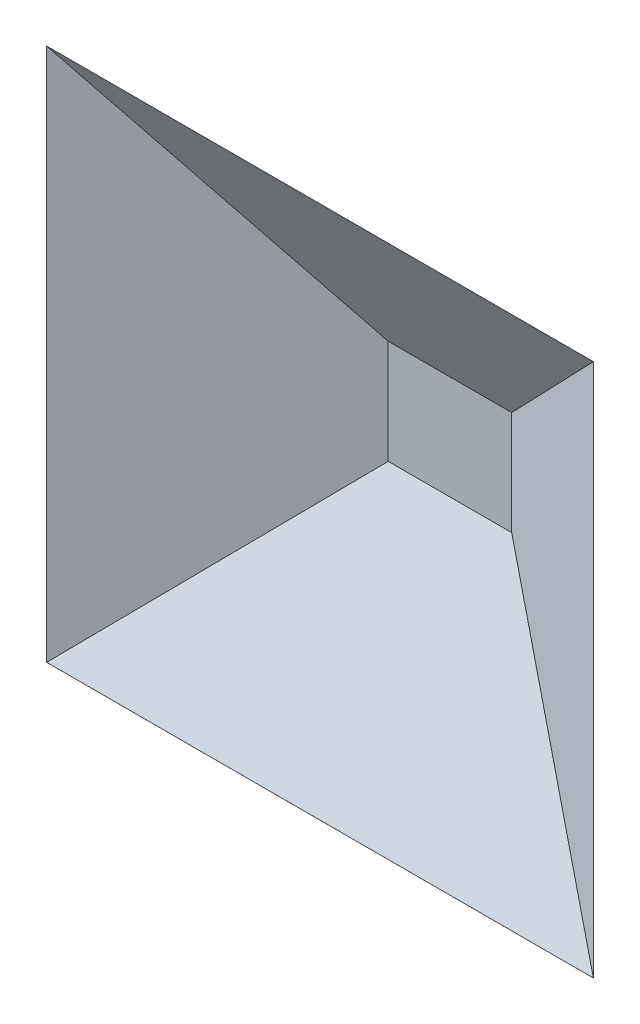
ISO-10303-21;
HEADER;
FILE_DESCRIPTION(('STEP AP214'),'2;1');
FILE_NAME('part.step','',(''),(''),'','','');
FILE_SCHEMA(('AUTOMOTIVE_DESIGN { 1 0 10303 214 1 1 1 1 }'));
ENDSEC;
DATA;
#1=APPLICATION_CONTEXT('core data for automotive mechanical design processes');
#2=APPLICATION_PROTOCOL_DEFINITION('international standard','automotive_design',2000,#1);
#3=PRODUCT_CONTEXT('',#1,'mechanical');
#4=PRODUCT('Part','Part','',(#3));
#5=PRODUCT_RELATED_PRODUCT_CATEGORY('part','',(#4));
#6=PRODUCT_DEFINITION_FORMATION('','',#4);
#7=PRODUCT_DEFINITION_CONTEXT('part definition',#1,'design');
#8=PRODUCT_DEFINITION('design','',#6,#7);
#9=PRODUCT_DEFINITION_SHAPE('','',#8);
#10=(LENGTH_UNIT() NAMED_UNIT(*) SI_UNIT(.MILLI.,.METRE.));
#11=(NAMED_UNIT(*) PLANE_ANGLE_UNIT() SI_UNIT($,.RADIAN.));
#12=(NAMED_UNIT(*) SI_UNIT($,.STERADIAN.) SOLID_ANGLE_UNIT());
#13=UNCERTAINTY_MEASURE_WITH_UNIT(LENGTH_MEASURE(1.E-05),#10,'distance_accuracy_value','');
#14=(GEOMETRIC_REPRESENTATION_CONTEXT(3) GLOBAL_UNCERTAINTY_ASSIGNED_CONTEXT((#13)) GLOBAL_UNIT_ASSIGNED_CONTEXT((#10,
#11,#12)) REPRESENTATION_CONTEXT('',''));
#15=CARTESIAN_POINT('',(0.,0.,0.));
#16=DIRECTION('',(0.,0.,1.));
#17=DIRECTION('',(1.,0.,0.));
#18=AXIS2_PLACEMENT_3D('',#15,#16,#17);
#19=CARTESIAN_POINT('',(0.,0.,100.));
#20=DIRECTION('',(0.,0.,1.));
#21=DIRECTION('',(1.,0.,0.));
#22=AXIS2_PLACEMENT_3D('',#19,#20,#21);
#23=PLANE('',#22);
#24=DIRECTION('',(0.,1.,0.));
#25=VECTOR('',#24,1.);
#26=CARTESIAN_POINT('',(210.280894021878,0.,100.));
#27=LINE('',#26,#25);
#28=CARTESIAN_POINT('',(210.280894021878,-205.280680556426,100.));
#29=VERTEX_POINT('',#28);
#30=CARTESIAN_POINT('',(210.280894021878,205.280680556426,100.));
#31=VERTEX_POINT('',#30);
#32=EDGE_CURVE('E297',#29,#31,#27,.T.);
#33=ORIENTED_EDGE('',*,*,#32,.F.);
#34=DIRECTION('',(1.,0.,0.));
#35=VECTOR('',#34,1.);
#36=CARTESIAN_POINT('',(0.,-205.280680556426,100.));
#37=LINE('',#36,#35);
#38=CARTESIAN_POINT('',(-210.280894021878,-205.280680556426,100.));
#39=VERTEX_POINT('',#38);
#40=EDGE_CURVE('E299',#39,#29,#37,.T.);
#41=ORIENTED_EDGE('',*,*,#40,.F.);
#42=DIRECTION('',(0.,-1.,0.));
#43=VECTOR('',#42,1.);
#44=CARTESIAN_POINT('',(-210.280894021878,0.,100.));
#45=LINE('',#44,#43);
#46=CARTESIAN_POINT('',(-210.280894021878,205.280680556426,100.));
#47=VERTEX_POINT('',#46);
#48=EDGE_CURVE('E309',#47,#39,#45,.T.);
#49=ORIENTED_EDGE('',*,*,#48,.F.);
#50=DIRECTION('',(-1.,0.,0.));
#51=VECTOR('',#50,1.);
#52=CARTESIAN_POINT('',(0.,205.280680556426,100.));
#53=LINE('',#52,#51);
#54=EDGE_CURVE('E302',#31,#47,#53,.T.);
#55=ORIENTED_EDGE('',*,*,#54,.F.);
#56=EDGE_LOOP('',(#33,#41,#49,#55));
#57=FACE_BOUND('',#56,.T.);
#58=DIRECTION('',(0.,1.,0.));
#59=VECTOR('',#58,1.);
#60=CARTESIAN_POINT('',(210.3,205.3,100.));
#61=LINE('',#60,#59);
#62=CARTESIAN_POINT('',(210.3,-205.3,100.));
#63=VERTEX_POINT('',#62);
#64=CARTESIAN_POINT('',(210.3,205.3,100.));
#65=VERTEX_POINT('',#64);
#66=EDGE_CURVE('E115',#63,#65,#61,.T.);
#67=ORIENTED_EDGE('',*,*,#66,.T.);
#68=DIRECTION('',(-1.,0.,0.));
#69=VECTOR('',#68,1.);
#70=CARTESIAN_POINT('',(-210.3,205.3,100.));
#71=LINE('',#70,#69);
#72=CARTESIAN_POINT('',(-210.3,205.3,100.));
#73=VERTEX_POINT('',#72);
#74=EDGE_CURVE('E124',#65,#73,#71,.T.);
#75=ORIENTED_EDGE('',*,*,#74,.T.);
#76=DIRECTION('',(0.,-1.,0.));
#77=VECTOR('',#76,1.);
#78=CARTESIAN_POINT('',(-210.3,205.3,100.));
#79=LINE('',#78,#77);
#80=CARTESIAN_POINT('',(-210.3,-205.3,100.));
#81=VERTEX_POINT('',#80);
#82=EDGE_CURVE('E131',#73,#81,#79,.T.);
#83=ORIENTED_EDGE('',*,*,#82,.T.);
#84=DIRECTION('',(1.,0.,0.));
#85=VECTOR('',#84,1.);
#86=CARTESIAN_POINT('',(-210.3,-205.3,100.));
#87=LINE('',#86,#85);
#88=EDGE_CURVE('E136',#81,#63,#87,.T.);
#89=ORIENTED_EDGE('',*,*,#88,.T.);
#90=EDGE_LOOP('',(#67,#75,#83,#89));
#91=FACE_BOUND('',#90,.T.);
#92=ADVANCED_FACE('F58',(#57,#91),#23,.T.);
#93=CARTESIAN_POINT('',(0.,0.,0.));
#94=DIRECTION('',(0.,0.,1.));
#95=DIRECTION('',(1.,0.,0.));
#96=AXIS2_PLACEMENT_3D('',#93,#94,#95);
#97=PLANE('',#96);
#98=DIRECTION('',(0.,1.,0.));
#99=VECTOR('',#98,1.);
#100=CARTESIAN_POINT('',(47.5,40.,0.));
#101=LINE('',#100,#99);
#102=CARTESIAN_POINT('',(47.5,-40.,0.));
#103=VERTEX_POINT('',#102);
#104=CARTESIAN_POINT('',(47.5,40.,0.));
#105=VERTEX_POINT('',#104);
#106=EDGE_CURVE('E118',#103,#105,#101,.T.);
#107=ORIENTED_EDGE('',*,*,#106,.F.);
#108=DIRECTION('',(1.,0.,0.));
#109=VECTOR('',#108,1.);
#110=CARTESIAN_POINT('',(-47.5,-40.,0.));
#111=LINE('',#110,#109);
#112=CARTESIAN_POINT('',(-47.5,-40.,0.));
#113=VERTEX_POINT('',#112);
#114=EDGE_CURVE('E198',#113,#103,#111,.T.);
#115=ORIENTED_EDGE('',*,*,#114,.F.);
#116=DIRECTION('',(0.,-1.,0.));
#117=VECTOR('',#116,1.);
#118=CARTESIAN_POINT('',(-47.5,40.,0.));
#119=LINE('',#118,#117);
#120=CARTESIAN_POINT('',(-47.5,40.,0.));
#121=VERTEX_POINT('',#120);
#122=EDGE_CURVE('E68',#121,#113,#119,.T.);
#123=ORIENTED_EDGE('',*,*,#122,.F.);
#124=DIRECTION('',(-1.,0.,0.));
#125=VECTOR('',#124,1.);
#126=CARTESIAN_POINT('',(-47.5,40.,0.));
#127=LINE('',#126,#125);
#128=EDGE_CURVE('E13',#105,#121,#127,.T.);
#129=ORIENTED_EDGE('',*,*,#128,.F.);
#130=EDGE_LOOP('',(#107,#115,#123,#129));
#131=FACE_BOUND('',#130,.T.);
#132=ADVANCED_FACE('F166',(#131),#97,.F.);
#133=CARTESIAN_POINT('',(0.,10.7169391135859,-17.7151003547575));
#134=DIRECTION('',(0.,0.517613251221071,-0.85561470426843));
#135=DIRECTION('',(0.,0.85561470426843,0.517613251221071));
#136=AXIS2_PLACEMENT_3D('',#133,#134,#135);
#137=PLANE('',#136);
#138=DIRECTION('',(-0.644390338796898,0.654285767832477,0.395817161423156));
#139=VECTOR('',#138,1.);
#140=CARTESIAN_POINT('',(-47.5,40.,0.));
#141=LINE('',#140,#139);
#142=EDGE_CURVE('E121',#121,#73,#141,.T.);
#143=ORIENTED_EDGE('',*,*,#142,.T.);
#144=ORIENTED_EDGE('',*,*,#74,.F.);
#145=DIRECTION('',(0.644390338796898,0.654285767832477,0.395817161423156));
#146=VECTOR('',#145,1.);
#147=CARTESIAN_POINT('',(47.5,40.,0.));
#148=LINE('',#147,#146);
#149=EDGE_CURVE('E110',#105,#65,#148,.T.);
#150=ORIENTED_EDGE('',*,*,#149,.F.);
#151=ORIENTED_EDGE('',*,*,#128,.T.);
#152=EDGE_LOOP('',(#143,#144,#150,#151));
#153=FACE_BOUND('',#152,.T.);
#154=ADVANCED_FACE('F126',(#153),#137,.T.);
#155=CARTESIAN_POINT('',(13.0123296617561,0.,-21.184072689339));
#156=DIRECTION('',(0.523396391230166,0.,-0.85208932492271));
#157=DIRECTION('',(-0.85208932492271,0.,-0.523396391230166));
#158=AXIS2_PLACEMENT_3D('',#155,#156,#157);
#159=PLANE('',#158);
#160=ORIENTED_EDGE('',*,*,#149,.T.);
#161=ORIENTED_EDGE('',*,*,#66,.F.);
#162=DIRECTION('',(0.644390338796898,-0.654285767832477,0.395817161423156));
#163=VECTOR('',#162,1.);
#164=CARTESIAN_POINT('',(47.5,-40.,0.));
#165=LINE('',#164,#163);
#166=EDGE_CURVE('E130',#103,#63,#165,.T.);
#167=ORIENTED_EDGE('',*,*,#166,.F.);
#168=ORIENTED_EDGE('',*,*,#106,.T.);
#169=EDGE_LOOP('',(#160,#161,#167,#168));
#170=FACE_BOUND('',#169,.T.);
#171=ADVANCED_FACE('F112',(#170),#159,.T.);
#172=CARTESIAN_POINT('',(-13.0123296617561,0.,-21.184072689339));
#173=DIRECTION('',(-0.523396391230166,0.,-0.85208932492271));
#174=DIRECTION('',(-0.85208932492271,0.,0.523396391230166));
#175=AXIS2_PLACEMENT_3D('',#172,#173,#174);
#176=PLANE('',#175);
#177=DIRECTION('',(-0.644390338796898,-0.654285767832477,0.395817161423156));
#178=VECTOR('',#177,1.);
#179=CARTESIAN_POINT('',(-47.5,-40.,0.));
#180=LINE('',#179,#178);
#181=EDGE_CURVE('E219',#113,#81,#180,.T.);
#182=ORIENTED_EDGE('',*,*,#181,.T.);
#183=ORIENTED_EDGE('',*,*,#82,.F.);
#184=ORIENTED_EDGE('',*,*,#142,.F.);
#185=ORIENTED_EDGE('',*,*,#122,.T.);
#186=EDGE_LOOP('',(#182,#183,#184,#185));
#187=FACE_BOUND('',#186,.T.);
#188=ADVANCED_FACE('F218',(#187),#176,.T.);
#189=CARTESIAN_POINT('',(0.,-10.7169391135859,-17.7151003547575));
#190=DIRECTION('',(0.,-0.517613251221071,-0.85561470426843));
#191=DIRECTION('',(0.,0.85561470426843,-0.517613251221071));
#192=AXIS2_PLACEMENT_3D('',#189,#190,#191);
#193=PLANE('',#192);
#194=ORIENTED_EDGE('',*,*,#166,.T.);
#195=ORIENTED_EDGE('',*,*,#88,.F.);
#196=ORIENTED_EDGE('',*,*,#181,.F.);
#197=ORIENTED_EDGE('',*,*,#114,.T.);
#198=EDGE_LOOP('',(#194,#195,#196,#197));
#199=FACE_BOUND('',#198,.T.);
#200=ADVANCED_FACE('F223',(#199),#193,.T.);
#201=CARTESIAN_POINT('',(0.,0.,0.01));
#202=DIRECTION('',(0.,0.,1.));
#203=DIRECTION('',(1.,0.,0.));
#204=AXIS2_PLACEMENT_3D('',#201,#202,#203);
#205=PLANE('',#204);
#206=DIRECTION('',(0.,1.,0.));
#207=VECTOR('',#206,1.);
#208=CARTESIAN_POINT('',(47.4971740218779,0.,0.01));
#209=LINE('',#208,#207);
#210=CARTESIAN_POINT('',(47.497174021878,-39.9972105564262,0.01));
#211=VERTEX_POINT('',#210);
#212=CARTESIAN_POINT('',(47.4971740218779,39.9972105564263,0.01));
#213=VERTEX_POINT('',#212);
#214=EDGE_CURVE('E333',#211,#213,#209,.T.);
#215=ORIENTED_EDGE('',*,*,#214,.T.);
#216=DIRECTION('',(-1.,0.,0.));
#217=VECTOR('',#216,1.);
#218=CARTESIAN_POINT('',(0.,39.9972105564262,0.01));
#219=LINE('',#218,#217);
#220=CARTESIAN_POINT('',(-47.497174021878,39.9972105564263,0.01));
#221=VERTEX_POINT('',#220);
#222=EDGE_CURVE('E138',#213,#221,#219,.T.);
#223=ORIENTED_EDGE('',*,*,#222,.T.);
#224=DIRECTION('',(0.,-1.,0.));
#225=VECTOR('',#224,1.);
#226=CARTESIAN_POINT('',(-47.497174021878,0.,0.01));
#227=LINE('',#226,#225);
#228=CARTESIAN_POINT('',(-47.497174021878,-39.9972105564262,0.01));
#229=VERTEX_POINT('',#228);
#230=EDGE_CURVE('E338',#221,#229,#227,.T.);
#231=ORIENTED_EDGE('',*,*,#230,.T.);
#232=DIRECTION('',(1.,0.,0.));
#233=VECTOR('',#232,1.);
#234=CARTESIAN_POINT('',(0.,-39.9972105564262,0.01));
#235=LINE('',#234,#233);
#236=EDGE_CURVE('E341',#229,#211,#235,.T.);
#237=ORIENTED_EDGE('',*,*,#236,.T.);
#238=EDGE_LOOP('',(#215,#223,#231,#237));
#239=FACE_BOUND('',#238,.T.);
#240=ADVANCED_FACE('F245',(#239),#205,.T.);
#241=CARTESIAN_POINT('',(0.,10.7117629810737,-17.7065442077148));
#242=DIRECTION('',(0.,0.517613251221071,-0.85561470426843));
#243=DIRECTION('',(0.,0.85561470426843,0.517613251221071));
#244=AXIS2_PLACEMENT_3D('',#241,#242,#243);
#245=PLANE('',#244);
#246=DIRECTION('',(-0.644390338796898,0.654285767832477,0.395817161423156));
#247=VECTOR('',#246,1.);
#248=CARTESIAN_POINT('',(-10.9085076738026,2.84667893887803,-22.4646107789161));
#249=LINE('',#248,#247);
#250=EDGE_CURVE('E328',#221,#47,#249,.T.);
#251=ORIENTED_EDGE('',*,*,#250,.F.);
#252=ORIENTED_EDGE('',*,*,#222,.F.);
#253=DIRECTION('',(0.644390338796898,0.654285767832477,0.395817161423156));
#254=VECTOR('',#253,1.);
#255=CARTESIAN_POINT('',(10.9085076738026,2.84667893887803,-22.4646107789161));
#256=LINE('',#255,#254);
#257=EDGE_CURVE('E330',#213,#31,#256,.T.);
#258=ORIENTED_EDGE('',*,*,#257,.T.);
#259=ORIENTED_EDGE('',*,*,#54,.T.);
#260=EDGE_LOOP('',(#251,#252,#258,#259));
#261=FACE_BOUND('',#260,.T.);
#262=ADVANCED_FACE('F356',(#261),#245,.F.);
#263=CARTESIAN_POINT('',(13.0070956978438,0.,-21.1755517960898));
#264=DIRECTION('',(0.523396391230166,0.,-0.85208932492271));
#265=DIRECTION('',(-0.85208932492271,0.,-0.523396391230166));
#266=AXIS2_PLACEMENT_3D('',#263,#264,#265);
#267=PLANE('',#266);
#268=ORIENTED_EDGE('',*,*,#257,.F.);
#269=ORIENTED_EDGE('',*,*,#214,.F.);
#270=DIRECTION('',(0.644390338796898,-0.654285767832477,0.395817161423156));
#271=VECTOR('',#270,1.);
#272=CARTESIAN_POINT('',(10.9085076738026,-2.84667893887801,-22.464610778916));
#273=LINE('',#272,#271);
#274=EDGE_CURVE('E326',#211,#29,#273,.T.);
#275=ORIENTED_EDGE('',*,*,#274,.T.);
#276=ORIENTED_EDGE('',*,*,#32,.T.);
#277=EDGE_LOOP('',(#268,#269,#275,#276));
#278=FACE_BOUND('',#277,.T.);
#279=ADVANCED_FACE('F353',(#278),#267,.F.);
#280=CARTESIAN_POINT('',(-13.0070956978438,0.,-21.1755517960898));
#281=DIRECTION('',(-0.523396391230166,0.,-0.85208932492271));
#282=DIRECTION('',(-0.85208932492271,0.,0.523396391230166));
#283=AXIS2_PLACEMENT_3D('',#280,#281,#282);
#284=PLANE('',#283);
#285=DIRECTION('',(-0.644390338796898,-0.654285767832477,0.395817161423156));
#286=VECTOR('',#285,1.);
#287=CARTESIAN_POINT('',(-10.9085076738026,-2.846678938878,-22.464610778916));
#288=LINE('',#287,#286);
#289=EDGE_CURVE('E76',#229,#39,#288,.T.);
#290=ORIENTED_EDGE('',*,*,#289,.F.);
#291=ORIENTED_EDGE('',*,*,#230,.F.);
#292=ORIENTED_EDGE('',*,*,#250,.T.);
#293=ORIENTED_EDGE('',*,*,#48,.T.);
#294=EDGE_LOOP('',(#290,#291,#292,#293));
#295=FACE_BOUND('',#294,.T.);
#296=ADVANCED_FACE('F363',(#295),#284,.F.);
#297=CARTESIAN_POINT('',(0.,-10.7117629810737,-17.7065442077148));
#298=DIRECTION('',(0.,-0.517613251221071,-0.85561470426843));
#299=DIRECTION('',(0.,0.85561470426843,-0.517613251221071));
#300=AXIS2_PLACEMENT_3D('',#297,#298,#299);
#301=PLANE('',#300);
#302=ORIENTED_EDGE('',*,*,#274,.F.);
#303=ORIENTED_EDGE('',*,*,#236,.F.);
#304=ORIENTED_EDGE('',*,*,#289,.T.);
#305=ORIENTED_EDGE('',*,*,#40,.T.);
#306=EDGE_LOOP('',(#302,#303,#304,#305));
#307=FACE_BOUND('',#306,.T.);
#308=ADVANCED_FACE('F176',(#307),#301,.F.);
#309=CLOSED_SHELL('',(#92,#132,#154,#171,#188,#200,#240,#262,#279,#296,#308));
#310=MANIFOLD_SOLID_BREP('B2',#309);
#311=ADVANCED_BREP_SHAPE_REPRESENTATION('',(#18,#310),#14);
#312=SHAPE_DEFINITION_REPRESENTATION(#9,#311);
ENDSEC;
END-ISO-10303-21;
